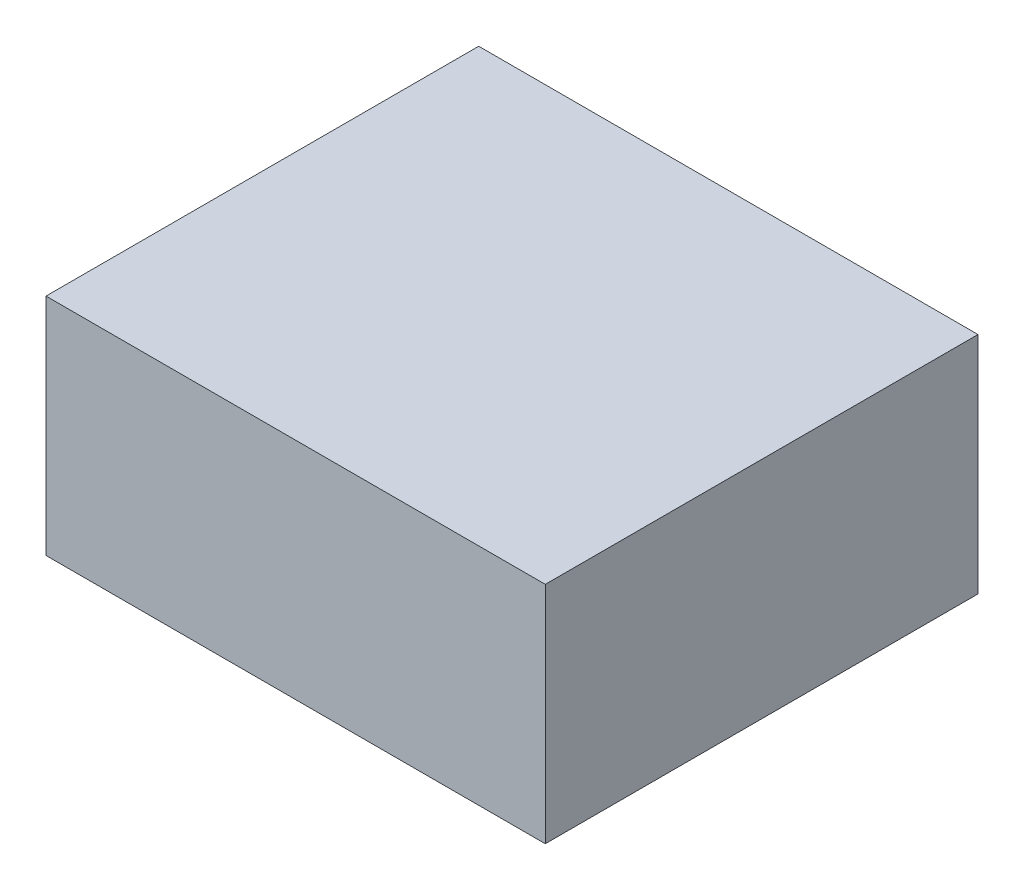
ISO-10303-21;
HEADER;
FILE_DESCRIPTION(('STEP AP214'),'2;1');
FILE_NAME('part.step','',(''),(''),'','','');
FILE_SCHEMA(('AUTOMOTIVE_DESIGN { 1 0 10303 214 1 1 1 1 }'));
ENDSEC;
DATA;
#1=APPLICATION_CONTEXT('core data for automotive mechanical design processes');
#2=APPLICATION_PROTOCOL_DEFINITION('international standard','automotive_design',2000,#1);
#3=PRODUCT_CONTEXT('',#1,'mechanical');
#4=PRODUCT('Part','Part','',(#3));
#5=PRODUCT_RELATED_PRODUCT_CATEGORY('part','',(#4));
#6=PRODUCT_DEFINITION_FORMATION('','',#4);
#7=PRODUCT_DEFINITION_CONTEXT('part definition',#1,'design');
#8=PRODUCT_DEFINITION('design','',#6,#7);
#9=PRODUCT_DEFINITION_SHAPE('','',#8);
#10=(LENGTH_UNIT() NAMED_UNIT(*) SI_UNIT(.MILLI.,.METRE.));
#11=(NAMED_UNIT(*) PLANE_ANGLE_UNIT() SI_UNIT($,.RADIAN.));
#12=(NAMED_UNIT(*) SI_UNIT($,.STERADIAN.) SOLID_ANGLE_UNIT());
#13=UNCERTAINTY_MEASURE_WITH_UNIT(LENGTH_MEASURE(1.E-05),#10,'distance_accuracy_value','');
#14=(GEOMETRIC_REPRESENTATION_CONTEXT(3) GLOBAL_UNCERTAINTY_ASSIGNED_CONTEXT((#13)) GLOBAL_UNIT_ASSIGNED_CONTEXT((#10,
#11,#12)) REPRESENTATION_CONTEXT('',''));
#15=CARTESIAN_POINT('',(0.,0.,0.));
#16=DIRECTION('',(0.,0.,1.));
#17=DIRECTION('',(1.,0.,0.));
#18=AXIS2_PLACEMENT_3D('',#15,#16,#17);
#19=CARTESIAN_POINT('',(30.,27.,26.));
#20=DIRECTION('',(-1.,0.,0.));
#21=DIRECTION('',(0.,0.,1.));
#22=AXIS2_PLACEMENT_3D('',#19,#20,#21);
#23=PLANE('',#22);
#24=DIRECTION('',(0.,0.,-1.));
#25=VECTOR('',#24,1.);
#26=CARTESIAN_POINT('',(30.,0.,26.));
#27=LINE('',#26,#25);
#28=CARTESIAN_POINT('',(30.,0.,26.));
#29=VERTEX_POINT('',#28);
#30=CARTESIAN_POINT('',(30.,0.,-26.));
#31=VERTEX_POINT('',#30);
#32=EDGE_CURVE('E99',#29,#31,#27,.T.);
#33=ORIENTED_EDGE('',*,*,#32,.T.);
#34=DIRECTION('',(0.,-1.,0.));
#35=VECTOR('',#34,1.);
#36=CARTESIAN_POINT('',(30.,27.,-26.));
#37=LINE('',#36,#35);
#38=CARTESIAN_POINT('',(30.,27.,-26.));
#39=VERTEX_POINT('',#38);
#40=EDGE_CURVE('E11',#39,#31,#37,.T.);
#41=ORIENTED_EDGE('',*,*,#40,.F.);
#42=DIRECTION('',(0.,0.,-1.));
#43=VECTOR('',#42,1.);
#44=CARTESIAN_POINT('',(30.,27.,26.));
#45=LINE('',#44,#43);
#46=CARTESIAN_POINT('',(30.,27.,26.));
#47=VERTEX_POINT('',#46);
#48=EDGE_CURVE('E87',#47,#39,#45,.T.);
#49=ORIENTED_EDGE('',*,*,#48,.F.);
#50=DIRECTION('',(0.,-1.,0.));
#51=VECTOR('',#50,1.);
#52=CARTESIAN_POINT('',(30.,27.,26.));
#53=LINE('',#52,#51);
#54=EDGE_CURVE('E95',#47,#29,#53,.T.);
#55=ORIENTED_EDGE('',*,*,#54,.T.);
#56=EDGE_LOOP('',(#33,#41,#49,#55));
#57=FACE_BOUND('',#56,.T.);
#58=ADVANCED_FACE('F36',(#57),#23,.F.);
#59=CARTESIAN_POINT('',(-30.,27.,-26.));
#60=DIRECTION('',(0.,0.,1.));
#61=DIRECTION('',(1.,0.,0.));
#62=AXIS2_PLACEMENT_3D('',#59,#60,#61);
#63=PLANE('',#62);
#64=DIRECTION('',(-1.,0.,0.));
#65=VECTOR('',#64,1.);
#66=CARTESIAN_POINT('',(-30.,0.,-26.));
#67=LINE('',#66,#65);
#68=CARTESIAN_POINT('',(-30.,0.,-26.));
#69=VERTEX_POINT('',#68);
#70=EDGE_CURVE('E91',#31,#69,#67,.T.);
#71=ORIENTED_EDGE('',*,*,#70,.T.);
#72=DIRECTION('',(0.,-1.,0.));
#73=VECTOR('',#72,1.);
#74=CARTESIAN_POINT('',(-30.,27.,-26.));
#75=LINE('',#74,#73);
#76=CARTESIAN_POINT('',(-30.,27.,-26.));
#77=VERTEX_POINT('',#76);
#78=EDGE_CURVE('E44',#77,#69,#75,.T.);
#79=ORIENTED_EDGE('',*,*,#78,.F.);
#80=DIRECTION('',(-1.,0.,0.));
#81=VECTOR('',#80,1.);
#82=CARTESIAN_POINT('',(-30.,27.,-26.));
#83=LINE('',#82,#81);
#84=EDGE_CURVE('E82',#39,#77,#83,.T.);
#85=ORIENTED_EDGE('',*,*,#84,.F.);
#86=ORIENTED_EDGE('',*,*,#40,.T.);
#87=EDGE_LOOP('',(#71,#79,#85,#86));
#88=FACE_BOUND('',#87,.T.);
#89=ADVANCED_FACE('F90',(#88),#63,.F.);
#90=CARTESIAN_POINT('',(-30.,27.,26.));
#91=DIRECTION('',(1.,0.,0.));
#92=DIRECTION('',(0.,0.,-1.));
#93=AXIS2_PLACEMENT_3D('',#90,#91,#92);
#94=PLANE('',#93);
#95=DIRECTION('',(0.,0.,1.));
#96=VECTOR('',#95,1.);
#97=CARTESIAN_POINT('',(-30.,0.,26.));
#98=LINE('',#97,#96);
#99=CARTESIAN_POINT('',(-30.,0.,26.));
#100=VERTEX_POINT('',#99);
#101=EDGE_CURVE('E69',#69,#100,#98,.T.);
#102=ORIENTED_EDGE('',*,*,#101,.T.);
#103=DIRECTION('',(0.,-1.,0.));
#104=VECTOR('',#103,1.);
#105=CARTESIAN_POINT('',(-30.,27.,26.));
#106=LINE('',#105,#104);
#107=CARTESIAN_POINT('',(-30.,27.,26.));
#108=VERTEX_POINT('',#107);
#109=EDGE_CURVE('E92',#108,#100,#106,.T.);
#110=ORIENTED_EDGE('',*,*,#109,.F.);
#111=DIRECTION('',(0.,0.,1.));
#112=VECTOR('',#111,1.);
#113=CARTESIAN_POINT('',(-30.,27.,26.));
#114=LINE('',#113,#112);
#115=EDGE_CURVE('E85',#77,#108,#114,.T.);
#116=ORIENTED_EDGE('',*,*,#115,.F.);
#117=ORIENTED_EDGE('',*,*,#78,.T.);
#118=EDGE_LOOP('',(#102,#110,#116,#117));
#119=FACE_BOUND('',#118,.T.);
#120=ADVANCED_FACE('F93',(#119),#94,.F.);
#121=CARTESIAN_POINT('',(-30.,27.,26.));
#122=DIRECTION('',(0.,0.,-1.));
#123=DIRECTION('',(-1.,0.,0.));
#124=AXIS2_PLACEMENT_3D('',#121,#122,#123);
#125=PLANE('',#124);
#126=DIRECTION('',(1.,0.,0.));
#127=VECTOR('',#126,1.);
#128=CARTESIAN_POINT('',(-30.,0.,26.));
#129=LINE('',#128,#127);
#130=EDGE_CURVE('E75',#100,#29,#129,.T.);
#131=ORIENTED_EDGE('',*,*,#130,.T.);
#132=ORIENTED_EDGE('',*,*,#54,.F.);
#133=DIRECTION('',(1.,0.,0.));
#134=VECTOR('',#133,1.);
#135=CARTESIAN_POINT('',(-30.,27.,26.));
#136=LINE('',#135,#134);
#137=EDGE_CURVE('E52',#108,#47,#136,.T.);
#138=ORIENTED_EDGE('',*,*,#137,.F.);
#139=ORIENTED_EDGE('',*,*,#109,.T.);
#140=EDGE_LOOP('',(#131,#132,#138,#139));
#141=FACE_BOUND('',#140,.T.);
#142=ADVANCED_FACE('F106',(#141),#125,.F.);
#143=CARTESIAN_POINT('',(0.,27.,0.));
#144=DIRECTION('',(0.,-1.,0.));
#145=DIRECTION('',(0.,0.,-1.));
#146=AXIS2_PLACEMENT_3D('',#143,#144,#145);
#147=PLANE('',#146);
#148=ORIENTED_EDGE('',*,*,#48,.T.);
#149=ORIENTED_EDGE('',*,*,#84,.T.);
#150=ORIENTED_EDGE('',*,*,#115,.T.);
#151=ORIENTED_EDGE('',*,*,#137,.T.);
#152=EDGE_LOOP('',(#148,#149,#150,#151));
#153=FACE_BOUND('',#152,.T.);
#154=ADVANCED_FACE('F83',(#153),#147,.F.);
#155=CARTESIAN_POINT('',(0.,0.,0.));
#156=DIRECTION('',(0.,-1.,0.));
#157=DIRECTION('',(0.,0.,-1.));
#158=AXIS2_PLACEMENT_3D('',#155,#156,#157);
#159=PLANE('',#158);
#160=ORIENTED_EDGE('',*,*,#32,.F.);
#161=ORIENTED_EDGE('',*,*,#130,.F.);
#162=ORIENTED_EDGE('',*,*,#101,.F.);
#163=ORIENTED_EDGE('',*,*,#70,.F.);
#164=EDGE_LOOP('',(#160,#161,#162,#163));
#165=FACE_BOUND('',#164,.T.);
#166=ADVANCED_FACE('F109',(#165),#159,.T.);
#167=CLOSED_SHELL('',(#58,#89,#120,#142,#154,#166));
#168=MANIFOLD_SOLID_BREP('B2',#167);
#169=ADVANCED_BREP_SHAPE_REPRESENTATION('',(#18,#168),#14);
#170=SHAPE_DEFINITION_REPRESENTATION(#9,#169);
ENDSEC;
END-ISO-10303-21;
